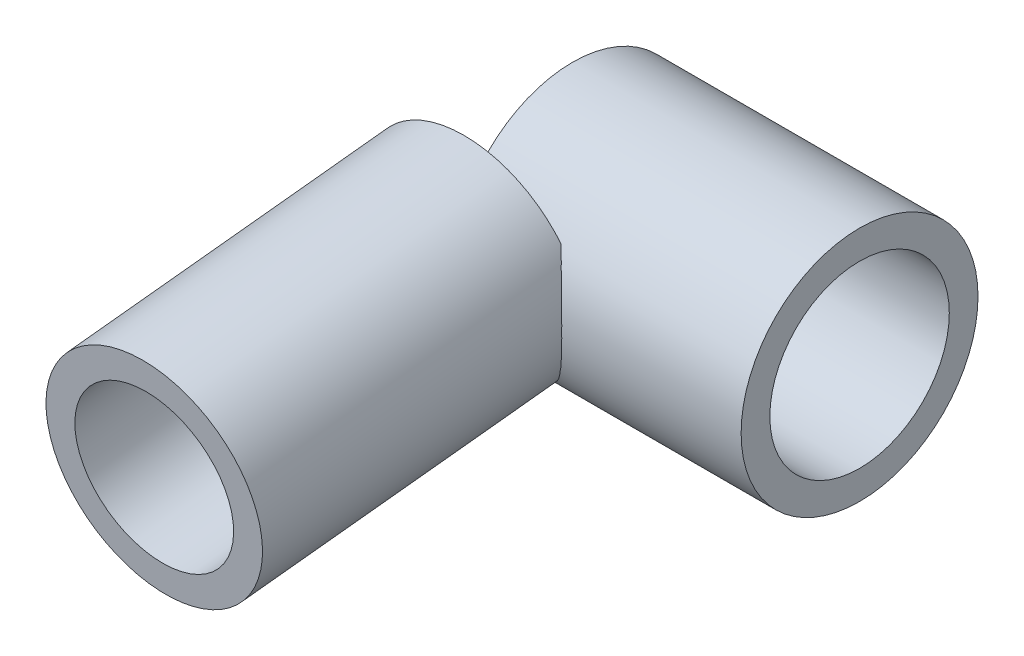
ISO-10303-21;
HEADER;
FILE_DESCRIPTION(('STEP AP214'),'2;1');
FILE_NAME('part.step','',(''),(''),'','','');
FILE_SCHEMA(('AUTOMOTIVE_DESIGN { 1 0 10303 214 1 1 1 1 }'));
ENDSEC;
DATA;
#1=APPLICATION_CONTEXT('core data for automotive mechanical design processes');
#2=APPLICATION_PROTOCOL_DEFINITION('international standard','automotive_design',2000,#1);
#3=PRODUCT_CONTEXT('',#1,'mechanical');
#4=PRODUCT('Part','Part','',(#3));
#5=PRODUCT_RELATED_PRODUCT_CATEGORY('part','',(#4));
#6=PRODUCT_DEFINITION_FORMATION('','',#4);
#7=PRODUCT_DEFINITION_CONTEXT('part definition',#1,'design');
#8=PRODUCT_DEFINITION('design','',#6,#7);
#9=PRODUCT_DEFINITION_SHAPE('','',#8);
#10=(LENGTH_UNIT() NAMED_UNIT(*) SI_UNIT(.MILLI.,.METRE.));
#11=(NAMED_UNIT(*) PLANE_ANGLE_UNIT() SI_UNIT($,.RADIAN.));
#12=(NAMED_UNIT(*) SI_UNIT($,.STERADIAN.) SOLID_ANGLE_UNIT());
#13=UNCERTAINTY_MEASURE_WITH_UNIT(LENGTH_MEASURE(1.E-05),#10,'distance_accuracy_value','');
#14=(GEOMETRIC_REPRESENTATION_CONTEXT(3) GLOBAL_UNCERTAINTY_ASSIGNED_CONTEXT((#13)) GLOBAL_UNIT_ASSIGNED_CONTEXT((#10,
#11,#12)) REPRESENTATION_CONTEXT('',''));
#15=CARTESIAN_POINT('',(0.,0.,0.));
#16=DIRECTION('',(0.,0.,1.));
#17=DIRECTION('',(1.,0.,0.));
#18=AXIS2_PLACEMENT_3D('',#15,#16,#17);
#19=CARTESIAN_POINT('',(40.,0.,0.));
#20=DIRECTION('',(1.,0.,0.));
#21=DIRECTION('',(0.,0.,-1.));
#22=AXIS2_PLACEMENT_3D('',#19,#20,#21);
#23=PLANE('',#22);
#24=CARTESIAN_POINT('',(40.,0.,-16.5));
#25=DIRECTION('',(-1.,0.,0.));
#26=DIRECTION('',(0.,0.,1.));
#27=AXIS2_PLACEMENT_3D('',#24,#25,#26);
#28=CIRCLE('',#27,12.5);
#29=CARTESIAN_POINT('',(40.,0.,-4.));
#30=VERTEX_POINT('',#29);
#31=EDGE_CURVE('E11',#30,#30,#28,.T.);
#32=ORIENTED_EDGE('',*,*,#31,.T.);
#33=EDGE_LOOP('',(#32));
#34=FACE_BOUND('',#33,.T.);
#35=CARTESIAN_POINT('',(40.,0.,-16.5));
#36=DIRECTION('',(-1.,0.,0.));
#37=DIRECTION('',(0.,0.,1.));
#38=AXIS2_PLACEMENT_3D('',#35,#36,#37);
#39=CIRCLE('',#38,16.5);
#40=CARTESIAN_POINT('',(40.,0.,0.));
#41=VERTEX_POINT('',#40);
#42=EDGE_CURVE('E59',#41,#41,#39,.T.);
#43=ORIENTED_EDGE('',*,*,#42,.F.);
#44=EDGE_LOOP('',(#43));
#45=FACE_BOUND('',#44,.T.);
#46=ADVANCED_FACE('F45',(#34,#45),#23,.T.);
#47=CARTESIAN_POINT('',(0.,0.,-16.5));
#48=DIRECTION('',(-1.,0.,0.));
#49=DIRECTION('',(0.,0.,1.));
#50=AXIS2_PLACEMENT_3D('',#47,#48,#49);
#51=CYLINDRICAL_SURFACE('',#50,12.5);
#52=CARTESIAN_POINT('',(0.,0.,-16.5));
#53=DIRECTION('',(-1.,0.,0.));
#54=DIRECTION('',(0.,0.,1.));
#55=AXIS2_PLACEMENT_3D('',#52,#53,#54);
#56=CIRCLE('',#55,12.5);
#57=CARTESIAN_POINT('',(0.,0.,-3.99999999999999));
#58=VERTEX_POINT('',#57);
#59=EDGE_CURVE('E51',#58,#58,#56,.T.);
#60=ORIENTED_EDGE('',*,*,#59,.T.);
#61=EDGE_LOOP('',(#60));
#62=FACE_BOUND('',#61,.T.);
#63=ORIENTED_EDGE('',*,*,#31,.F.);
#64=EDGE_LOOP('',(#63));
#65=FACE_BOUND('',#64,.T.);
#66=ADVANCED_FACE('F69',(#62,#65),#51,.F.);
#67=CARTESIAN_POINT('',(0.,0.,0.));
#68=DIRECTION('',(-1.,0.,0.));
#69=DIRECTION('',(0.,0.,1.));
#70=AXIS2_PLACEMENT_3D('',#67,#68,#69);
#71=PLANE('',#70);
#72=CARTESIAN_POINT('',(0.,0.,-16.5));
#73=DIRECTION('',(-1.,0.,0.));
#74=DIRECTION('',(0.,0.,1.));
#75=AXIS2_PLACEMENT_3D('',#72,#73,#74);
#76=CIRCLE('',#75,16.5);
#77=CARTESIAN_POINT('',(0.,0.,0.));
#78=VERTEX_POINT('',#77);
#79=EDGE_CURVE('E55',#78,#78,#76,.T.);
#80=ORIENTED_EDGE('',*,*,#79,.T.);
#81=EDGE_LOOP('',(#80));
#82=FACE_BOUND('',#81,.T.);
#83=ORIENTED_EDGE('',*,*,#59,.F.);
#84=EDGE_LOOP('',(#83));
#85=FACE_BOUND('',#84,.T.);
#86=ADVANCED_FACE('F73',(#82,#85),#71,.T.);
#87=CARTESIAN_POINT('',(0.,0.,-16.5));
#88=DIRECTION('',(-1.,0.,0.));
#89=DIRECTION('',(0.,0.,1.));
#90=AXIS2_PLACEMENT_3D('',#87,#88,#89);
#91=CYLINDRICAL_SURFACE('',#90,16.5);
#92=ORIENTED_EDGE('',*,*,#42,.T.);
#93=EDGE_LOOP('',(#92));
#94=FACE_BOUND('',#93,.T.);
#95=ORIENTED_EDGE('',*,*,#79,.F.);
#96=EDGE_LOOP('',(#95));
#97=FACE_BOUND('',#96,.T.);
#98=ADVANCED_FACE('F65',(#94,#97),#91,.T.);
#99=CLOSED_SHELL('',(#46,#66,#86,#98));
#100=MANIFOLD_SOLID_BREP('B2',#99);
#101=CARTESIAN_POINT('',(11.,0.317358163780568,-2.98316673953734));
#102=DIRECTION('',(0.,-0.105786054593523,0.994388913179112));
#103=DIRECTION('',(0.,-0.994388913179112,-0.105786054593523));
#104=AXIS2_PLACEMENT_3D('',#101,#102,#103);
#105=PLANE('',#104);
#106=CARTESIAN_POINT('',(0.,0.317358163780568,-2.98316673953734));
#107=DIRECTION('',(0.,0.105786054593523,-0.994388913179112));
#108=DIRECTION('',(0.,0.994388913179112,0.105786054593523));
#109=AXIS2_PLACEMENT_3D('',#106,#107,#108);
#110=CIRCLE('',#109,11.);
#111=CARTESIAN_POINT('',(0.,11.2556362087508,-1.81952013900859));
#112=VERTEX_POINT('',#111);
#113=EDGE_CURVE('E44',#112,#112,#110,.T.);
#114=ORIENTED_EDGE('',*,*,#113,.F.);
#115=EDGE_LOOP('',(#114));
#116=FACE_BOUND('',#115,.T.);
#117=CARTESIAN_POINT('',(0.,0.317358163780568,-2.98316673953734));
#118=DIRECTION('',(0.,0.105786054593523,-0.994388913179112));
#119=DIRECTION('',(0.,0.994388913179112,0.105786054593523));
#120=AXIS2_PLACEMENT_3D('',#117,#118,#119);
#121=CIRCLE('',#120,15.);
#122=CARTESIAN_POINT('',(0.,15.2331918614672,-1.3963759206345));
#123=VERTEX_POINT('',#122);
#124=EDGE_CURVE('E121',#123,#123,#121,.T.);
#125=ORIENTED_EDGE('',*,*,#124,.T.);
#126=EDGE_LOOP('',(#125));
#127=FACE_BOUND('',#126,.T.);
#128=ADVANCED_FACE('F107',(#116,#127),#105,.F.);
#129=CARTESIAN_POINT('',(0.,0.,0.));
#130=DIRECTION('',(0.,0.105786054593523,-0.994388913179112));
#131=DIRECTION('',(0.,0.994388913179112,0.105786054593523));
#132=AXIS2_PLACEMENT_3D('',#129,#130,#131);
#133=CYLINDRICAL_SURFACE('',#132,11.);
#134=CARTESIAN_POINT('',(0.,-4.44301429292795,41.7643343535227));
#135=DIRECTION('',(0.,0.105786054593523,-0.994388913179112));
#136=DIRECTION('',(0.,0.994388913179112,0.105786054593523));
#137=AXIS2_PLACEMENT_3D('',#134,#135,#136);
#138=CIRCLE('',#137,11.);
#139=CARTESIAN_POINT('',(0.,6.49526375204229,42.9279809540515));
#140=VERTEX_POINT('',#139);
#141=EDGE_CURVE('E113',#140,#140,#138,.T.);
#142=ORIENTED_EDGE('',*,*,#141,.F.);
#143=EDGE_LOOP('',(#142));
#144=FACE_BOUND('',#143,.T.);
#145=ORIENTED_EDGE('',*,*,#113,.T.);
#146=EDGE_LOOP('',(#145));
#147=FACE_BOUND('',#146,.T.);
#148=ADVANCED_FACE('F136',(#144,#147),#133,.F.);
#149=CARTESIAN_POINT('',(11.,-4.44301429292795,41.7643343535227));
#150=DIRECTION('',(0.,0.105786054593523,-0.994388913179112));
#151=DIRECTION('',(0.,0.994388913179112,0.105786054593523));
#152=AXIS2_PLACEMENT_3D('',#149,#150,#151);
#153=PLANE('',#152);
#154=CARTESIAN_POINT('',(0.,-4.44301429292795,41.7643343535227));
#155=DIRECTION('',(0.,0.105786054593523,-0.994388913179112));
#156=DIRECTION('',(0.,0.994388913179112,0.105786054593523));
#157=AXIS2_PLACEMENT_3D('',#154,#155,#156);
#158=CIRCLE('',#157,15.);
#159=CARTESIAN_POINT('',(0.,10.4728194047587,43.3511251724256));
#160=VERTEX_POINT('',#159);
#161=EDGE_CURVE('E117',#160,#160,#158,.T.);
#162=ORIENTED_EDGE('',*,*,#161,.F.);
#163=EDGE_LOOP('',(#162));
#164=FACE_BOUND('',#163,.T.);
#165=ORIENTED_EDGE('',*,*,#141,.T.);
#166=EDGE_LOOP('',(#165));
#167=FACE_BOUND('',#166,.T.);
#168=ADVANCED_FACE('F131',(#164,#167),#153,.F.);
#169=CARTESIAN_POINT('',(0.,0.,0.));
#170=DIRECTION('',(0.,0.105786054593523,-0.994388913179112));
#171=DIRECTION('',(0.,0.994388913179112,0.105786054593523));
#172=AXIS2_PLACEMENT_3D('',#169,#170,#171);
#173=CYLINDRICAL_SURFACE('',#172,15.);
#174=ORIENTED_EDGE('',*,*,#124,.F.);
#175=EDGE_LOOP('',(#174));
#176=FACE_BOUND('',#175,.T.);
#177=ORIENTED_EDGE('',*,*,#161,.T.);
#178=EDGE_LOOP('',(#177));
#179=FACE_BOUND('',#178,.T.);
#180=ADVANCED_FACE('F128',(#176,#179),#173,.T.);
#181=CLOSED_SHELL('',(#128,#148,#168,#180));
#182=MANIFOLD_SOLID_BREP('B6',#181);
#183=ADVANCED_BREP_SHAPE_REPRESENTATION('',(#18,#100,#182),#14);
#184=SHAPE_DEFINITION_REPRESENTATION(#9,#183);
ENDSEC;
END-ISO-10303-21;
